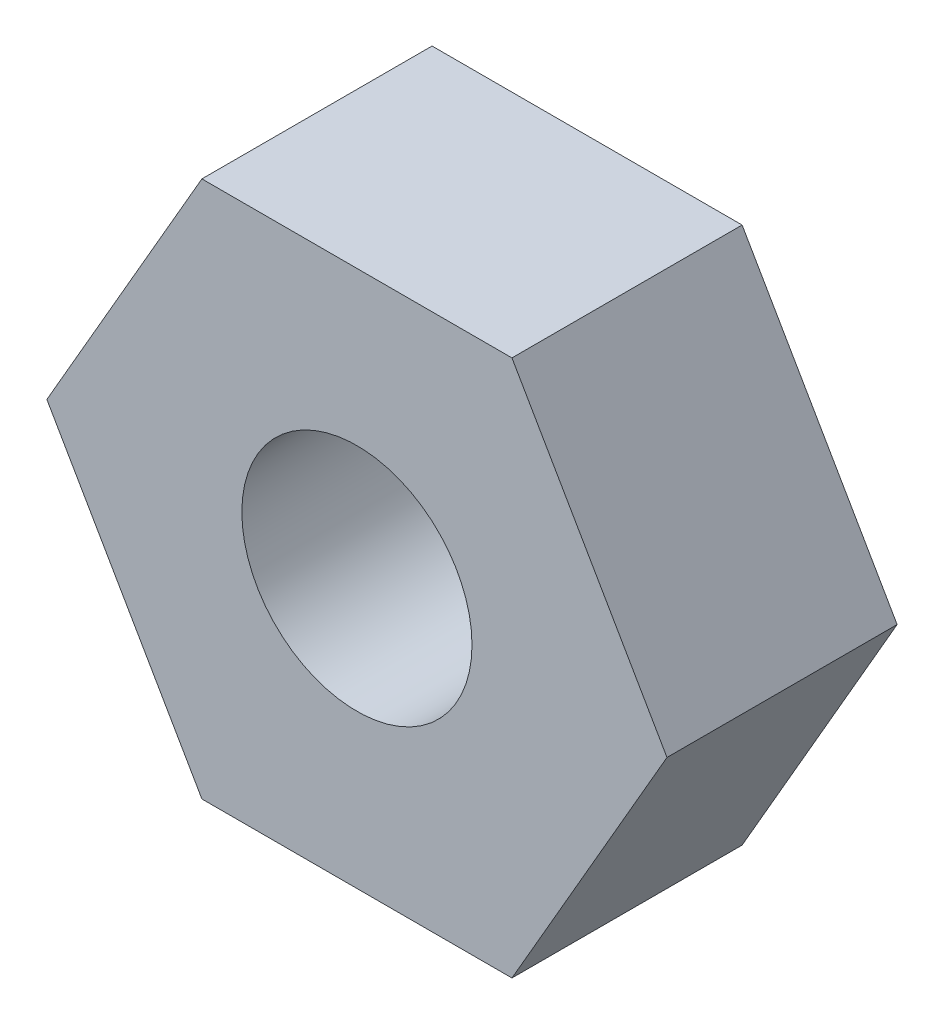
ISO-10303-21;
HEADER;
FILE_DESCRIPTION(('STEP AP214'),'2;1');
FILE_NAME('part.step','',(''),(''),'','','');
FILE_SCHEMA(('AUTOMOTIVE_DESIGN { 1 0 10303 214 1 1 1 1 }'));
ENDSEC;
DATA;
#1=APPLICATION_CONTEXT('core data for automotive mechanical design processes');
#2=APPLICATION_PROTOCOL_DEFINITION('international standard','automotive_design',2000,#1);
#3=PRODUCT_CONTEXT('',#1,'mechanical');
#4=PRODUCT('Part','Part','',(#3));
#5=PRODUCT_RELATED_PRODUCT_CATEGORY('part','',(#4));
#6=PRODUCT_DEFINITION_FORMATION('','',#4);
#7=PRODUCT_DEFINITION_CONTEXT('part definition',#1,'design');
#8=PRODUCT_DEFINITION('design','',#6,#7);
#9=PRODUCT_DEFINITION_SHAPE('','',#8);
#10=(LENGTH_UNIT() NAMED_UNIT(*) SI_UNIT(.MILLI.,.METRE.));
#11=(NAMED_UNIT(*) PLANE_ANGLE_UNIT() SI_UNIT($,.RADIAN.));
#12=(NAMED_UNIT(*) SI_UNIT($,.STERADIAN.) SOLID_ANGLE_UNIT());
#13=UNCERTAINTY_MEASURE_WITH_UNIT(LENGTH_MEASURE(1.E-05),#10,'distance_accuracy_value','');
#14=(GEOMETRIC_REPRESENTATION_CONTEXT(3) GLOBAL_UNCERTAINTY_ASSIGNED_CONTEXT((#13)) GLOBAL_UNIT_ASSIGNED_CONTEXT((#10,
#11,#12)) REPRESENTATION_CONTEXT('',''));
#15=CARTESIAN_POINT('',(0.,0.,0.));
#16=DIRECTION('',(0.,0.,1.));
#17=DIRECTION('',(1.,0.,0.));
#18=AXIS2_PLACEMENT_3D('',#15,#16,#17);
#19=CARTESIAN_POINT('',(0.,0.,3.));
#20=DIRECTION('',(0.,0.,1.));
#21=DIRECTION('',(1.,0.,0.));
#22=AXIS2_PLACEMENT_3D('',#19,#20,#21);
#23=PLANE('',#22);
#24=DIRECTION('',(-0.500000000000006,-0.866025403784435,0.));
#25=VECTOR('',#24,1.);
#26=CARTESIAN_POINT('',(-2.02072594216367,3.50000000000003,3.));
#27=LINE('',#26,#25);
#28=CARTESIAN_POINT('',(-2.02072594216367,3.50000000000003,3.));
#29=VERTEX_POINT('',#28);
#30=CARTESIAN_POINT('',(-4.04145188432739,0.,3.));
#31=VERTEX_POINT('',#30);
#32=EDGE_CURVE('E129',#29,#31,#27,.T.);
#33=ORIENTED_EDGE('',*,*,#32,.T.);
#34=DIRECTION('',(0.499999999999994,-0.866025403784442,0.));
#35=VECTOR('',#34,1.);
#36=CARTESIAN_POINT('',(-4.04145188432739,0.,3.));
#37=LINE('',#36,#35);
#38=CARTESIAN_POINT('',(-2.02072594216372,-3.5,3.));
#39=VERTEX_POINT('',#38);
#40=EDGE_CURVE('E87',#31,#39,#37,.T.);
#41=ORIENTED_EDGE('',*,*,#40,.T.);
#42=DIRECTION('',(1.,0.,0.));
#43=VECTOR('',#42,1.);
#44=CARTESIAN_POINT('',(-2.02072594216372,-3.5,3.));
#45=LINE('',#44,#43);
#46=CARTESIAN_POINT('',(2.02072594216367,-3.50000000000003,3.));
#47=VERTEX_POINT('',#46);
#48=EDGE_CURVE('E100',#39,#47,#45,.T.);
#49=ORIENTED_EDGE('',*,*,#48,.T.);
#50=DIRECTION('',(0.500000000000006,0.866025403784435,0.));
#51=VECTOR('',#50,1.);
#52=CARTESIAN_POINT('',(2.02072594216367,-3.50000000000003,3.));
#53=LINE('',#52,#51);
#54=CARTESIAN_POINT('',(4.0414518843274,0.,3.));
#55=VERTEX_POINT('',#54);
#56=EDGE_CURVE('E94',#47,#55,#53,.T.);
#57=ORIENTED_EDGE('',*,*,#56,.T.);
#58=DIRECTION('',(-0.499999999999994,0.866025403784442,0.));
#59=VECTOR('',#58,1.);
#60=CARTESIAN_POINT('',(4.0414518843274,0.,3.));
#61=LINE('',#60,#59);
#62=CARTESIAN_POINT('',(2.02072594216372,3.5,3.));
#63=VERTEX_POINT('',#62);
#64=EDGE_CURVE('E98',#55,#63,#61,.T.);
#65=ORIENTED_EDGE('',*,*,#64,.T.);
#66=DIRECTION('',(-1.,0.,0.));
#67=VECTOR('',#66,1.);
#68=CARTESIAN_POINT('',(2.02072594216372,3.5,3.));
#69=LINE('',#68,#67);
#70=EDGE_CURVE('E50',#63,#29,#69,.T.);
#71=ORIENTED_EDGE('',*,*,#70,.T.);
#72=EDGE_LOOP('',(#33,#41,#49,#57,#65,#71));
#73=FACE_BOUND('',#72,.T.);
#74=CARTESIAN_POINT('',(0.,0.,3.));
#75=DIRECTION('',(0.,0.,1.));
#76=DIRECTION('',(1.,0.,0.));
#77=AXIS2_PLACEMENT_3D('',#74,#75,#76);
#78=CIRCLE('',#77,1.5);
#79=CARTESIAN_POINT('',(1.5,0.,3.));
#80=VERTEX_POINT('',#79);
#81=EDGE_CURVE('E122',#80,#80,#78,.T.);
#82=ORIENTED_EDGE('',*,*,#81,.F.);
#83=EDGE_LOOP('',(#82));
#84=FACE_BOUND('',#83,.T.);
#85=ADVANCED_FACE('F33',(#73,#84),#23,.T.);
#86=CARTESIAN_POINT('',(0.,0.,0.));
#87=DIRECTION('',(0.,0.,1.));
#88=DIRECTION('',(1.,0.,0.));
#89=AXIS2_PLACEMENT_3D('',#86,#87,#88);
#90=PLANE('',#89);
#91=DIRECTION('',(-0.500000000000006,-0.866025403784435,0.));
#92=VECTOR('',#91,1.);
#93=CARTESIAN_POINT('',(-2.02072594216367,3.50000000000003,0.));
#94=LINE('',#93,#92);
#95=CARTESIAN_POINT('',(-2.02072594216367,3.50000000000003,0.));
#96=VERTEX_POINT('',#95);
#97=CARTESIAN_POINT('',(-4.04145188432739,0.,0.));
#98=VERTEX_POINT('',#97);
#99=EDGE_CURVE('E118',#96,#98,#94,.T.);
#100=ORIENTED_EDGE('',*,*,#99,.F.);
#101=DIRECTION('',(-1.,0.,0.));
#102=VECTOR('',#101,1.);
#103=CARTESIAN_POINT('',(2.02072594216372,3.5,0.));
#104=LINE('',#103,#102);
#105=CARTESIAN_POINT('',(2.02072594216372,3.5,0.));
#106=VERTEX_POINT('',#105);
#107=EDGE_CURVE('E79',#106,#96,#104,.T.);
#108=ORIENTED_EDGE('',*,*,#107,.F.);
#109=DIRECTION('',(-0.499999999999994,0.866025403784442,0.));
#110=VECTOR('',#109,1.);
#111=CARTESIAN_POINT('',(4.0414518843274,0.,0.));
#112=LINE('',#111,#110);
#113=CARTESIAN_POINT('',(4.0414518843274,0.,0.));
#114=VERTEX_POINT('',#113);
#115=EDGE_CURVE('E73',#114,#106,#112,.T.);
#116=ORIENTED_EDGE('',*,*,#115,.F.);
#117=DIRECTION('',(0.500000000000006,0.866025403784435,0.));
#118=VECTOR('',#117,1.);
#119=CARTESIAN_POINT('',(2.02072594216367,-3.50000000000003,0.));
#120=LINE('',#119,#118);
#121=CARTESIAN_POINT('',(2.02072594216367,-3.50000000000003,0.));
#122=VERTEX_POINT('',#121);
#123=EDGE_CURVE('E108',#122,#114,#120,.T.);
#124=ORIENTED_EDGE('',*,*,#123,.F.);
#125=DIRECTION('',(1.,0.,0.));
#126=VECTOR('',#125,1.);
#127=CARTESIAN_POINT('',(-2.02072594216372,-3.5,0.));
#128=LINE('',#127,#126);
#129=CARTESIAN_POINT('',(-2.02072594216372,-3.5,0.));
#130=VERTEX_POINT('',#129);
#131=EDGE_CURVE('E124',#130,#122,#128,.T.);
#132=ORIENTED_EDGE('',*,*,#131,.F.);
#133=DIRECTION('',(0.499999999999994,-0.866025403784442,0.));
#134=VECTOR('',#133,1.);
#135=CARTESIAN_POINT('',(-4.04145188432739,0.,0.));
#136=LINE('',#135,#134);
#137=EDGE_CURVE('E121',#98,#130,#136,.T.);
#138=ORIENTED_EDGE('',*,*,#137,.F.);
#139=EDGE_LOOP('',(#100,#108,#116,#124,#132,#138));
#140=FACE_BOUND('',#139,.T.);
#141=CARTESIAN_POINT('',(0.,0.,0.));
#142=DIRECTION('',(0.,0.,1.));
#143=DIRECTION('',(1.,0.,0.));
#144=AXIS2_PLACEMENT_3D('',#141,#142,#143);
#145=CIRCLE('',#144,1.5);
#146=CARTESIAN_POINT('',(1.5,0.,0.));
#147=VERTEX_POINT('',#146);
#148=EDGE_CURVE('E222',#147,#147,#145,.T.);
#149=ORIENTED_EDGE('',*,*,#148,.T.);
#150=EDGE_LOOP('',(#149));
#151=FACE_BOUND('',#150,.T.);
#152=ADVANCED_FACE('F138',(#140,#151),#90,.F.);
#153=CARTESIAN_POINT('',(-2.02072594216367,3.50000000000003,3.));
#154=DIRECTION('',(0.866025403784435,-0.500000000000006,0.));
#155=DIRECTION('',(0.500000000000006,0.866025403784435,0.));
#156=AXIS2_PLACEMENT_3D('',#153,#154,#155);
#157=PLANE('',#156);
#158=ORIENTED_EDGE('',*,*,#99,.T.);
#159=DIRECTION('',(0.,0.,-1.));
#160=VECTOR('',#159,1.);
#161=CARTESIAN_POINT('',(-4.04145188432739,0.,3.));
#162=LINE('',#161,#160);
#163=EDGE_CURVE('E11',#31,#98,#162,.T.);
#164=ORIENTED_EDGE('',*,*,#163,.F.);
#165=ORIENTED_EDGE('',*,*,#32,.F.);
#166=DIRECTION('',(0.,0.,-1.));
#167=VECTOR('',#166,1.);
#168=CARTESIAN_POINT('',(-2.02072594216367,3.50000000000003,3.));
#169=LINE('',#168,#167);
#170=EDGE_CURVE('E114',#29,#96,#169,.T.);
#171=ORIENTED_EDGE('',*,*,#170,.T.);
#172=EDGE_LOOP('',(#158,#164,#165,#171));
#173=FACE_BOUND('',#172,.T.);
#174=ADVANCED_FACE('F35',(#173),#157,.F.);
#175=CARTESIAN_POINT('',(-4.04145188432739,0.,3.));
#176=DIRECTION('',(0.866025403784442,0.499999999999994,0.));
#177=DIRECTION('',(-0.499999999999994,0.866025403784442,0.));
#178=AXIS2_PLACEMENT_3D('',#175,#176,#177);
#179=PLANE('',#178);
#180=ORIENTED_EDGE('',*,*,#137,.T.);
#181=DIRECTION('',(0.,0.,-1.));
#182=VECTOR('',#181,1.);
#183=CARTESIAN_POINT('',(-2.02072594216372,-3.5,3.));
#184=LINE('',#183,#182);
#185=EDGE_CURVE('E42',#39,#130,#184,.T.);
#186=ORIENTED_EDGE('',*,*,#185,.F.);
#187=ORIENTED_EDGE('',*,*,#40,.F.);
#188=ORIENTED_EDGE('',*,*,#163,.T.);
#189=EDGE_LOOP('',(#180,#186,#187,#188));
#190=FACE_BOUND('',#189,.T.);
#191=ADVANCED_FACE('F163',(#190),#179,.F.);
#192=CARTESIAN_POINT('',(-2.02072594216372,-3.5,3.));
#193=DIRECTION('',(0.,1.,0.));
#194=DIRECTION('',(-1.,0.,0.));
#195=AXIS2_PLACEMENT_3D('',#192,#193,#194);
#196=PLANE('',#195);
#197=ORIENTED_EDGE('',*,*,#131,.T.);
#198=DIRECTION('',(0.,0.,-1.));
#199=VECTOR('',#198,1.);
#200=CARTESIAN_POINT('',(2.02072594216367,-3.50000000000003,3.));
#201=LINE('',#200,#199);
#202=EDGE_CURVE('E109',#47,#122,#201,.T.);
#203=ORIENTED_EDGE('',*,*,#202,.F.);
#204=ORIENTED_EDGE('',*,*,#48,.F.);
#205=ORIENTED_EDGE('',*,*,#185,.T.);
#206=EDGE_LOOP('',(#197,#203,#204,#205));
#207=FACE_BOUND('',#206,.T.);
#208=ADVANCED_FACE('F135',(#207),#196,.F.);
#209=CARTESIAN_POINT('',(2.02072594216367,-3.50000000000003,3.));
#210=DIRECTION('',(-0.866025403784435,0.500000000000006,0.));
#211=DIRECTION('',(-0.500000000000006,-0.866025403784435,0.));
#212=AXIS2_PLACEMENT_3D('',#209,#210,#211);
#213=PLANE('',#212);
#214=ORIENTED_EDGE('',*,*,#123,.T.);
#215=DIRECTION('',(0.,0.,-1.));
#216=VECTOR('',#215,1.);
#217=CARTESIAN_POINT('',(4.0414518843274,0.,3.));
#218=LINE('',#217,#216);
#219=EDGE_CURVE('E105',#55,#114,#218,.T.);
#220=ORIENTED_EDGE('',*,*,#219,.F.);
#221=ORIENTED_EDGE('',*,*,#56,.F.);
#222=ORIENTED_EDGE('',*,*,#202,.T.);
#223=EDGE_LOOP('',(#214,#220,#221,#222));
#224=FACE_BOUND('',#223,.T.);
#225=ADVANCED_FACE('F106',(#224),#213,.F.);
#226=CARTESIAN_POINT('',(4.0414518843274,0.,3.));
#227=DIRECTION('',(-0.866025403784442,-0.499999999999994,0.));
#228=DIRECTION('',(0.499999999999994,-0.866025403784442,0.));
#229=AXIS2_PLACEMENT_3D('',#226,#227,#228);
#230=PLANE('',#229);
#231=ORIENTED_EDGE('',*,*,#115,.T.);
#232=DIRECTION('',(0.,0.,-1.));
#233=VECTOR('',#232,1.);
#234=CARTESIAN_POINT('',(2.02072594216372,3.5,3.));
#235=LINE('',#234,#233);
#236=EDGE_CURVE('E110',#63,#106,#235,.T.);
#237=ORIENTED_EDGE('',*,*,#236,.F.);
#238=ORIENTED_EDGE('',*,*,#64,.F.);
#239=ORIENTED_EDGE('',*,*,#219,.T.);
#240=EDGE_LOOP('',(#231,#237,#238,#239));
#241=FACE_BOUND('',#240,.T.);
#242=ADVANCED_FACE('F112',(#241),#230,.F.);
#243=CARTESIAN_POINT('',(2.02072594216372,3.5,3.));
#244=DIRECTION('',(0.,-1.,0.));
#245=DIRECTION('',(1.,0.,0.));
#246=AXIS2_PLACEMENT_3D('',#243,#244,#245);
#247=PLANE('',#246);
#248=ORIENTED_EDGE('',*,*,#107,.T.);
#249=ORIENTED_EDGE('',*,*,#170,.F.);
#250=ORIENTED_EDGE('',*,*,#70,.F.);
#251=ORIENTED_EDGE('',*,*,#236,.T.);
#252=EDGE_LOOP('',(#248,#249,#250,#251));
#253=FACE_BOUND('',#252,.T.);
#254=ADVANCED_FACE('F143',(#253),#247,.F.);
#255=CARTESIAN_POINT('',(0.,0.,3.));
#256=DIRECTION('',(0.,0.,-1.));
#257=DIRECTION('',(-1.,0.,0.));
#258=AXIS2_PLACEMENT_3D('',#255,#256,#257);
#259=CYLINDRICAL_SURFACE('',#258,1.5);
#260=ORIENTED_EDGE('',*,*,#81,.T.);
#261=EDGE_LOOP('',(#260));
#262=FACE_BOUND('',#261,.T.);
#263=ORIENTED_EDGE('',*,*,#148,.F.);
#264=EDGE_LOOP('',(#263));
#265=FACE_BOUND('',#264,.T.);
#266=ADVANCED_FACE('F145',(#262,#265),#259,.F.);
#267=CLOSED_SHELL('',(#85,#152,#174,#191,#208,#225,#242,#254,#266));
#268=MANIFOLD_SOLID_BREP('B2',#267);
#269=ADVANCED_BREP_SHAPE_REPRESENTATION('',(#18,#268),#14);
#270=SHAPE_DEFINITION_REPRESENTATION(#9,#269);
ENDSEC;
END-ISO-10303-21;
